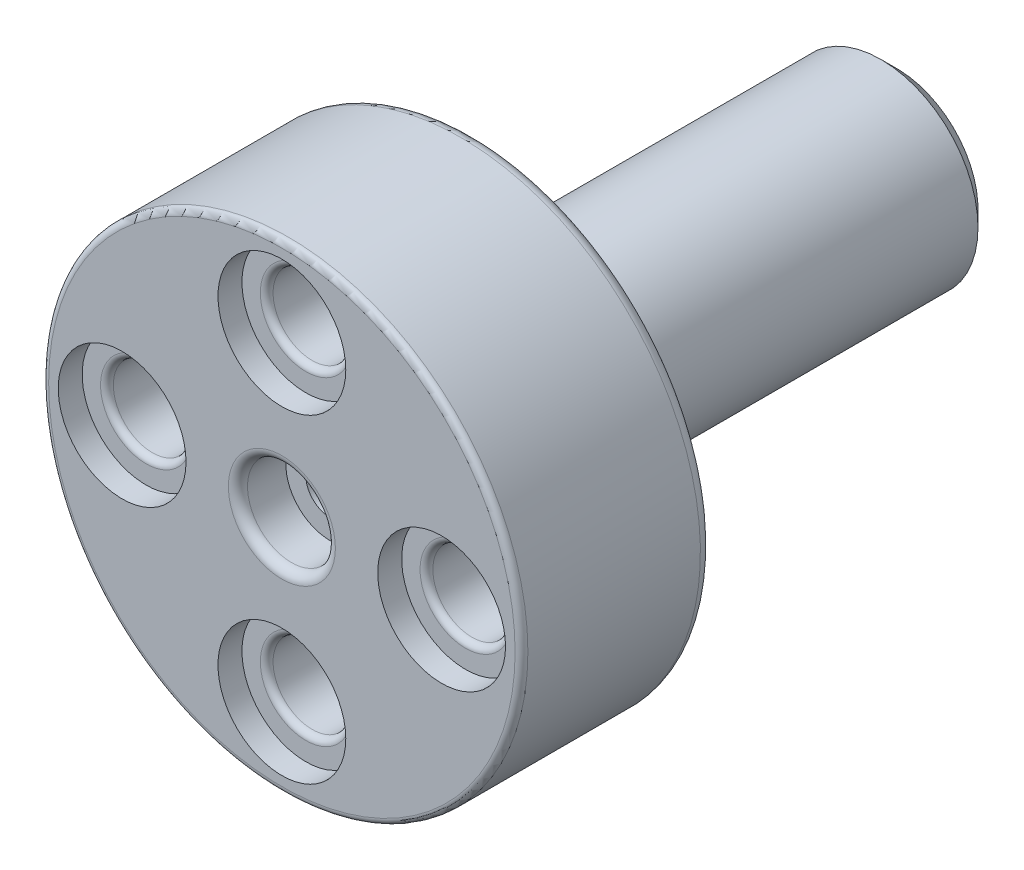
ISO-10303-21;
HEADER;
FILE_DESCRIPTION(('STEP AP214'),'2;1');
FILE_NAME('part.step','',(''),(''),'','','');
FILE_SCHEMA(('AUTOMOTIVE_DESIGN { 1 0 10303 214 1 1 1 1 }'));
ENDSEC;
DATA;
#1=APPLICATION_CONTEXT('core data for automotive mechanical design processes');
#2=APPLICATION_PROTOCOL_DEFINITION('international standard','automotive_design',2000,#1);
#3=PRODUCT_CONTEXT('',#1,'mechanical');
#4=PRODUCT('Part','Part','',(#3));
#5=PRODUCT_RELATED_PRODUCT_CATEGORY('part','',(#4));
#6=PRODUCT_DEFINITION_FORMATION('','',#4);
#7=PRODUCT_DEFINITION_CONTEXT('part definition',#1,'design');
#8=PRODUCT_DEFINITION('design','',#6,#7);
#9=PRODUCT_DEFINITION_SHAPE('','',#8);
#10=(LENGTH_UNIT() NAMED_UNIT(*) SI_UNIT(.MILLI.,.METRE.));
#11=(NAMED_UNIT(*) PLANE_ANGLE_UNIT() SI_UNIT($,.RADIAN.));
#12=(NAMED_UNIT(*) SI_UNIT($,.STERADIAN.) SOLID_ANGLE_UNIT());
#13=UNCERTAINTY_MEASURE_WITH_UNIT(LENGTH_MEASURE(1.E-05),#10,'distance_accuracy_value','');
#14=(GEOMETRIC_REPRESENTATION_CONTEXT(3) GLOBAL_UNCERTAINTY_ASSIGNED_CONTEXT((#13)) GLOBAL_UNIT_ASSIGNED_CONTEXT((#10,
#11,#12)) REPRESENTATION_CONTEXT('',''));
#15=CARTESIAN_POINT('',(0.,0.,0.));
#16=DIRECTION('',(0.,0.,1.));
#17=DIRECTION('',(1.,0.,0.));
#18=AXIS2_PLACEMENT_3D('',#15,#16,#17);
#19=CARTESIAN_POINT('',(0.,0.,-17.3));
#20=DIRECTION('',(0.,0.,1.));
#21=DIRECTION('',(1.,0.,0.));
#22=AXIS2_PLACEMENT_3D('',#19,#20,#21);
#23=CYLINDRICAL_SURFACE('',#22,1.5);
#24=CARTESIAN_POINT('',(0.,0.,-17.3));
#25=DIRECTION('',(0.,0.,1.));
#26=DIRECTION('',(1.,0.,0.));
#27=AXIS2_PLACEMENT_3D('',#24,#25,#26);
#28=CIRCLE('',#27,1.5);
#29=CARTESIAN_POINT('',(1.5,0.,-17.3));
#30=VERTEX_POINT('',#29);
#31=EDGE_CURVE('E324',#30,#30,#28,.T.);
#32=ORIENTED_EDGE('',*,*,#31,.F.);
#33=EDGE_LOOP('',(#32));
#34=FACE_BOUND('',#33,.T.);
#35=CARTESIAN_POINT('',(0.,0.,18.2));
#36=DIRECTION('',(0.,0.,1.));
#37=DIRECTION('',(1.,0.,0.));
#38=AXIS2_PLACEMENT_3D('',#35,#36,#37);
#39=CIRCLE('',#38,1.5);
#40=CARTESIAN_POINT('',(1.5,0.,18.2));
#41=VERTEX_POINT('',#40);
#42=EDGE_CURVE('E321',#41,#41,#39,.F.);
#43=ORIENTED_EDGE('',*,*,#42,.F.);
#44=EDGE_LOOP('',(#43));
#45=FACE_BOUND('',#44,.T.);
#46=ADVANCED_FACE('F37',(#34,#45),#23,.F.);
#47=CARTESIAN_POINT('',(10.,0.,-16.5000000539506));
#48=DIRECTION('',(0.,0.,1.));
#49=DIRECTION('',(1.,0.,0.));
#50=AXIS2_PLACEMENT_3D('',#47,#48,#49);
#51=CYLINDRICAL_SURFACE('',#50,2.45);
#52=CARTESIAN_POINT('',(10.,0.,11.3));
#53=DIRECTION('',(0.,0.,1.));
#54=DIRECTION('',(1.,0.,0.));
#55=AXIS2_PLACEMENT_3D('',#52,#53,#54);
#56=CIRCLE('',#55,2.45);
#57=CARTESIAN_POINT('',(12.45,0.,11.3));
#58=VERTEX_POINT('',#57);
#59=EDGE_CURVE('E412',#58,#58,#56,.T.);
#60=ORIENTED_EDGE('',*,*,#59,.F.);
#61=EDGE_LOOP('',(#60));
#62=FACE_BOUND('',#61,.T.);
#63=CARTESIAN_POINT('',(10.,0.,19.3));
#64=DIRECTION('',(0.,0.,1.));
#65=DIRECTION('',(1.,0.,0.));
#66=AXIS2_PLACEMENT_3D('',#63,#64,#65);
#67=CIRCLE('',#66,2.45);
#68=CARTESIAN_POINT('',(12.45,0.,19.3));
#69=VERTEX_POINT('',#68);
#70=EDGE_CURVE('E339',#69,#69,#67,.T.);
#71=ORIENTED_EDGE('',*,*,#70,.T.);
#72=EDGE_LOOP('',(#71));
#73=FACE_BOUND('',#72,.T.);
#74=ADVANCED_FACE('F160',(#62,#73),#51,.F.);
#75=CARTESIAN_POINT('',(0.,-10.,-16.5000000539506));
#76=DIRECTION('',(0.,0.,1.));
#77=DIRECTION('',(1.,0.,0.));
#78=AXIS2_PLACEMENT_3D('',#75,#76,#77);
#79=CYLINDRICAL_SURFACE('',#78,2.45);
#80=CARTESIAN_POINT('',(0.,-10.,11.3));
#81=DIRECTION('',(0.,0.,1.));
#82=DIRECTION('',(1.,0.,0.));
#83=AXIS2_PLACEMENT_3D('',#80,#81,#82);
#84=CIRCLE('',#83,2.45);
#85=CARTESIAN_POINT('',(2.45,-10.,11.3));
#86=VERTEX_POINT('',#85);
#87=EDGE_CURVE('E394',#86,#86,#84,.T.);
#88=ORIENTED_EDGE('',*,*,#87,.F.);
#89=EDGE_LOOP('',(#88));
#90=FACE_BOUND('',#89,.T.);
#91=CARTESIAN_POINT('',(0.,-10.,19.3));
#92=DIRECTION('',(0.,0.,1.));
#93=DIRECTION('',(1.,0.,0.));
#94=AXIS2_PLACEMENT_3D('',#91,#92,#93);
#95=CIRCLE('',#94,2.45);
#96=CARTESIAN_POINT('',(2.45,-10.,19.3));
#97=VERTEX_POINT('',#96);
#98=EDGE_CURVE('E333',#97,#97,#95,.T.);
#99=ORIENTED_EDGE('',*,*,#98,.T.);
#100=EDGE_LOOP('',(#99));
#101=FACE_BOUND('',#100,.T.);
#102=ADVANCED_FACE('F166',(#90,#101),#79,.F.);
#103=CARTESIAN_POINT('',(-10.,0.,-16.5000000539506));
#104=DIRECTION('',(0.,0.,1.));
#105=DIRECTION('',(1.,0.,0.));
#106=AXIS2_PLACEMENT_3D('',#103,#104,#105);
#107=CYLINDRICAL_SURFACE('',#106,2.45);
#108=CARTESIAN_POINT('',(-10.,0.,11.3));
#109=DIRECTION('',(0.,0.,1.));
#110=DIRECTION('',(1.,0.,0.));
#111=AXIS2_PLACEMENT_3D('',#108,#109,#110);
#112=CIRCLE('',#111,2.45);
#113=CARTESIAN_POINT('',(-7.55,0.,11.3));
#114=VERTEX_POINT('',#113);
#115=EDGE_CURVE('E385',#114,#114,#112,.T.);
#116=ORIENTED_EDGE('',*,*,#115,.F.);
#117=EDGE_LOOP('',(#116));
#118=FACE_BOUND('',#117,.T.);
#119=CARTESIAN_POINT('',(-10.,0.,19.3));
#120=DIRECTION('',(0.,0.,1.));
#121=DIRECTION('',(1.,0.,0.));
#122=AXIS2_PLACEMENT_3D('',#119,#120,#121);
#123=CIRCLE('',#122,2.45);
#124=CARTESIAN_POINT('',(-7.55,0.,19.3));
#125=VERTEX_POINT('',#124);
#126=EDGE_CURVE('E327',#125,#125,#123,.T.);
#127=ORIENTED_EDGE('',*,*,#126,.T.);
#128=EDGE_LOOP('',(#127));
#129=FACE_BOUND('',#128,.T.);
#130=ADVANCED_FACE('F253',(#118,#129),#107,.F.);
#131=CARTESIAN_POINT('',(0.,10.,-16.5000000539506));
#132=DIRECTION('',(0.,0.,1.));
#133=DIRECTION('',(1.,0.,0.));
#134=AXIS2_PLACEMENT_3D('',#131,#132,#133);
#135=CYLINDRICAL_SURFACE('',#134,2.45);
#136=CARTESIAN_POINT('',(0.,10.,11.3));
#137=DIRECTION('',(0.,0.,1.));
#138=DIRECTION('',(1.,0.,0.));
#139=AXIS2_PLACEMENT_3D('',#136,#137,#138);
#140=CIRCLE('',#139,2.45);
#141=CARTESIAN_POINT('',(2.45,10.,11.3));
#142=VERTEX_POINT('',#141);
#143=EDGE_CURVE('E403',#142,#142,#140,.T.);
#144=ORIENTED_EDGE('',*,*,#143,.F.);
#145=EDGE_LOOP('',(#144));
#146=FACE_BOUND('',#145,.T.);
#147=CARTESIAN_POINT('',(0.,10.,19.3));
#148=DIRECTION('',(0.,0.,1.));
#149=DIRECTION('',(1.,0.,0.));
#150=AXIS2_PLACEMENT_3D('',#147,#148,#149);
#151=CIRCLE('',#150,2.45);
#152=CARTESIAN_POINT('',(2.45,10.,19.3));
#153=VERTEX_POINT('',#152);
#154=EDGE_CURVE('E345',#153,#153,#151,.T.);
#155=ORIENTED_EDGE('',*,*,#154,.T.);
#156=EDGE_LOOP('',(#155));
#157=FACE_BOUND('',#156,.T.);
#158=ADVANCED_FACE('F249',(#146,#157),#135,.F.);
#159=CARTESIAN_POINT('',(0.,0.,9.2));
#160=DIRECTION('',(0.,0.,1.));
#161=DIRECTION('',(1.,0.,0.));
#162=AXIS2_PLACEMENT_3D('',#159,#160,#161);
#163=PLANE('',#162);
#164=CARTESIAN_POINT('',(0.,0.,9.2));
#165=DIRECTION('',(0.,0.,1.));
#166=DIRECTION('',(1.,0.,0.));
#167=AXIS2_PLACEMENT_3D('',#164,#165,#166);
#168=CIRCLE('',#167,14.2);
#169=CARTESIAN_POINT('',(-8.14478529140609,11.6319591022706,9.2));
#170=VERTEX_POINT('',#169);
#171=CARTESIAN_POINT('',(11.6319589555369,-8.14478550096353,9.2));
#172=VERTEX_POINT('',#171);
#173=EDGE_CURVE('E113',#170,#172,#168,.F.);
#174=ORIENTED_EDGE('',*,*,#173,.T.);
#175=CARTESIAN_POINT('',(0.,0.,9.2));
#176=DIRECTION('',(0.,0.,1.));
#177=DIRECTION('',(1.,0.,0.));
#178=AXIS2_PLACEMENT_3D('',#175,#176,#177);
#179=CIRCLE('',#178,14.2);
#180=CARTESIAN_POINT('',(8.14478529140617,-11.6319591022705,9.2));
#181=VERTEX_POINT('',#180);
#182=EDGE_CURVE('E95',#172,#181,#179,.F.);
#183=ORIENTED_EDGE('',*,*,#182,.T.);
#184=CARTESIAN_POINT('',(0.,0.,9.2));
#185=DIRECTION('',(0.,0.,1.));
#186=DIRECTION('',(1.,0.,0.));
#187=AXIS2_PLACEMENT_3D('',#184,#185,#186);
#188=CIRCLE('',#187,14.2);
#189=CARTESIAN_POINT('',(-8.14478550096365,-11.6319589555368,9.2));
#190=VERTEX_POINT('',#189);
#191=EDGE_CURVE('E59',#181,#190,#188,.F.);
#192=ORIENTED_EDGE('',*,*,#191,.T.);
#193=CARTESIAN_POINT('',(0.,0.,9.2));
#194=DIRECTION('',(0.,0.,1.));
#195=DIRECTION('',(1.,0.,0.));
#196=AXIS2_PLACEMENT_3D('',#193,#194,#195);
#197=CIRCLE('',#196,14.2);
#198=CARTESIAN_POINT('',(-11.6319591022706,-8.14478529140605,9.2));
#199=VERTEX_POINT('',#198);
#200=EDGE_CURVE('E124',#190,#199,#197,.F.);
#201=ORIENTED_EDGE('',*,*,#200,.T.);
#202=CARTESIAN_POINT('',(0.,0.,9.2));
#203=DIRECTION('',(0.,0.,1.));
#204=DIRECTION('',(1.,0.,0.));
#205=AXIS2_PLACEMENT_3D('',#202,#203,#204);
#206=CIRCLE('',#205,14.2);
#207=CARTESIAN_POINT('',(-11.6319589555368,8.14478550096361,9.2));
#208=VERTEX_POINT('',#207);
#209=EDGE_CURVE('E122',#199,#208,#206,.F.);
#210=ORIENTED_EDGE('',*,*,#209,.T.);
#211=CARTESIAN_POINT('',(0.,0.,9.2));
#212=DIRECTION('',(0.,0.,1.));
#213=DIRECTION('',(1.,0.,0.));
#214=AXIS2_PLACEMENT_3D('',#211,#212,#213);
#215=CIRCLE('',#214,14.2);
#216=EDGE_CURVE('E115',#208,#170,#215,.F.);
#217=ORIENTED_EDGE('',*,*,#216,.T.);
#218=EDGE_LOOP('',(#174,#183,#192,#201,#210,#217));
#219=FACE_BOUND('',#218,.T.);
#220=CARTESIAN_POINT('',(0.,0.,9.2));
#221=DIRECTION('',(0.,0.,1.));
#222=DIRECTION('',(1.,0.,0.));
#223=AXIS2_PLACEMENT_3D('',#220,#221,#222);
#224=CIRCLE('',#223,6.075);
#225=CARTESIAN_POINT('',(6.075,0.,9.2));
#226=VERTEX_POINT('',#225);
#227=EDGE_CURVE('E107',#226,#226,#224,.F.);
#228=ORIENTED_EDGE('',*,*,#227,.F.);
#229=EDGE_LOOP('',(#228));
#230=FACE_BOUND('',#229,.T.);
#231=CARTESIAN_POINT('',(10.,0.,9.2));
#232=DIRECTION('',(0.,0.,-1.));
#233=DIRECTION('',(-1.,0.,0.));
#234=AXIS2_PLACEMENT_3D('',#231,#232,#233);
#235=CIRCLE('',#234,3.);
#236=CARTESIAN_POINT('',(7.,0.,9.2));
#237=VERTEX_POINT('',#236);
#238=EDGE_CURVE('E375',#237,#237,#235,.T.);
#239=ORIENTED_EDGE('',*,*,#238,.F.);
#240=EDGE_LOOP('',(#239));
#241=FACE_BOUND('',#240,.T.);
#242=CARTESIAN_POINT('',(0.,10.,9.2));
#243=DIRECTION('',(0.,0.,-1.));
#244=DIRECTION('',(-1.,0.,0.));
#245=AXIS2_PLACEMENT_3D('',#242,#243,#244);
#246=CIRCLE('',#245,3.);
#247=CARTESIAN_POINT('',(-3.,10.,9.2));
#248=VERTEX_POINT('',#247);
#249=EDGE_CURVE('E404',#248,#248,#246,.T.);
#250=ORIENTED_EDGE('',*,*,#249,.F.);
#251=EDGE_LOOP('',(#250));
#252=FACE_BOUND('',#251,.T.);
#253=CARTESIAN_POINT('',(0.,-10.,9.2));
#254=DIRECTION('',(0.,0.,-1.));
#255=DIRECTION('',(-1.,0.,0.));
#256=AXIS2_PLACEMENT_3D('',#253,#254,#255);
#257=CIRCLE('',#256,3.);
#258=CARTESIAN_POINT('',(-3.,-10.,9.2));
#259=VERTEX_POINT('',#258);
#260=EDGE_CURVE('E395',#259,#259,#257,.T.);
#261=ORIENTED_EDGE('',*,*,#260,.F.);
#262=EDGE_LOOP('',(#261));
#263=FACE_BOUND('',#262,.T.);
#264=CARTESIAN_POINT('',(-10.,0.,9.2));
#265=DIRECTION('',(0.,0.,-1.));
#266=DIRECTION('',(-1.,0.,0.));
#267=AXIS2_PLACEMENT_3D('',#264,#265,#266);
#268=CIRCLE('',#267,3.);
#269=CARTESIAN_POINT('',(-13.,0.,9.2));
#270=VERTEX_POINT('',#269);
#271=EDGE_CURVE('E386',#270,#270,#268,.T.);
#272=ORIENTED_EDGE('',*,*,#271,.F.);
#273=EDGE_LOOP('',(#272));
#274=FACE_BOUND('',#273,.T.);
#275=ADVANCED_FACE('F252',(#219,#230,#241,#252,#263,#274),#163,.F.);
#276=CARTESIAN_POINT('',(0.,0.,21.2));
#277=DIRECTION('',(0.,0.,-1.));
#278=DIRECTION('',(-1.,0.,0.));
#279=AXIS2_PLACEMENT_3D('',#276,#277,#278);
#280=CYLINDRICAL_SURFACE('',#279,15.);
#281=CARTESIAN_POINT('',(0.,0.,10.));
#282=DIRECTION('',(0.,0.,1.));
#283=DIRECTION('',(1.,0.,0.));
#284=AXIS2_PLACEMENT_3D('',#281,#282,#283);
#285=CIRCLE('',#284,15.);
#286=CARTESIAN_POINT('',(-8.60364665594751,-12.2872805868346,10.));
#287=VERTEX_POINT('',#286);
#288=CARTESIAN_POINT('',(8.60364643458398,-12.287280741835,10.));
#289=VERTEX_POINT('',#288);
#290=EDGE_CURVE('E112',#287,#289,#285,.T.);
#291=ORIENTED_EDGE('',*,*,#290,.T.);
#292=CARTESIAN_POINT('',(0.,0.,10.));
#293=DIRECTION('',(0.,0.,1.));
#294=DIRECTION('',(1.,0.,0.));
#295=AXIS2_PLACEMENT_3D('',#292,#293,#294);
#296=CIRCLE('',#295,15.);
#297=CARTESIAN_POINT('',(12.2872805868347,-8.60364665594739,10.));
#298=VERTEX_POINT('',#297);
#299=EDGE_CURVE('E94',#289,#298,#296,.T.);
#300=ORIENTED_EDGE('',*,*,#299,.T.);
#301=CARTESIAN_POINT('',(0.,0.,10.));
#302=DIRECTION('',(0.,0.,1.));
#303=DIRECTION('',(1.,0.,0.));
#304=AXIS2_PLACEMENT_3D('',#301,#302,#303);
#305=CIRCLE('',#304,15.);
#306=CARTESIAN_POINT('',(-8.6036464345839,12.2872807418351,10.));
#307=VERTEX_POINT('',#306);
#308=EDGE_CURVE('E100',#298,#307,#305,.T.);
#309=ORIENTED_EDGE('',*,*,#308,.T.);
#310=CARTESIAN_POINT('',(0.,0.,10.));
#311=DIRECTION('',(0.,0.,1.));
#312=DIRECTION('',(1.,0.,0.));
#313=AXIS2_PLACEMENT_3D('',#310,#311,#312);
#314=CIRCLE('',#313,15.);
#315=CARTESIAN_POINT('',(-12.2872805868347,8.60364665594747,10.));
#316=VERTEX_POINT('',#315);
#317=EDGE_CURVE('E106',#307,#316,#314,.T.);
#318=ORIENTED_EDGE('',*,*,#317,.T.);
#319=CARTESIAN_POINT('',(0.,0.,10.));
#320=DIRECTION('',(0.,0.,1.));
#321=DIRECTION('',(1.,0.,0.));
#322=AXIS2_PLACEMENT_3D('',#319,#320,#321);
#323=CIRCLE('',#322,15.);
#324=CARTESIAN_POINT('',(-12.2872807418351,-8.60364643458386,10.));
#325=VERTEX_POINT('',#324);
#326=EDGE_CURVE('E314',#316,#325,#323,.T.);
#327=ORIENTED_EDGE('',*,*,#326,.T.);
#328=CARTESIAN_POINT('',(0.,0.,10.));
#329=DIRECTION('',(0.,0.,1.));
#330=DIRECTION('',(1.,0.,0.));
#331=AXIS2_PLACEMENT_3D('',#328,#329,#330);
#332=CIRCLE('',#331,15.);
#333=EDGE_CURVE('E117',#325,#287,#332,.T.);
#334=ORIENTED_EDGE('',*,*,#333,.T.);
#335=EDGE_LOOP('',(#291,#300,#309,#318,#327,#334));
#336=FACE_BOUND('',#335,.T.);
#337=CARTESIAN_POINT('',(0.,0.,20.8));
#338=DIRECTION('',(0.,0.,1.));
#339=DIRECTION('',(1.,0.,0.));
#340=AXIS2_PLACEMENT_3D('',#337,#338,#339);
#341=CIRCLE('',#340,15.);
#342=CARTESIAN_POINT('',(15.,0.,20.8));
#343=VERTEX_POINT('',#342);
#344=EDGE_CURVE('E351',#343,#343,#341,.F.);
#345=ORIENTED_EDGE('',*,*,#344,.T.);
#346=EDGE_LOOP('',(#345));
#347=FACE_BOUND('',#346,.T.);
#348=ADVANCED_FACE('F109',(#336,#347),#280,.T.);
#349=CARTESIAN_POINT('',(0.,0.,21.2));
#350=DIRECTION('',(0.,0.,1.));
#351=DIRECTION('',(1.,0.,0.));
#352=AXIS2_PLACEMENT_3D('',#349,#350,#351);
#353=PLANE('',#352);
#354=CARTESIAN_POINT('',(0.,0.,21.2));
#355=DIRECTION('',(0.,0.,1.));
#356=DIRECTION('',(1.,0.,0.));
#357=AXIS2_PLACEMENT_3D('',#354,#355,#356);
#358=CIRCLE('',#357,3.35);
#359=CARTESIAN_POINT('',(3.35,0.,21.2));
#360=VERTEX_POINT('',#359);
#361=EDGE_CURVE('E143',#360,#360,#358,.F.);
#362=ORIENTED_EDGE('',*,*,#361,.T.);
#363=EDGE_LOOP('',(#362));
#364=FACE_BOUND('',#363,.T.);
#365=CARTESIAN_POINT('',(0.,0.,21.2));
#366=DIRECTION('',(0.,0.,1.));
#367=DIRECTION('',(1.,0.,0.));
#368=AXIS2_PLACEMENT_3D('',#365,#366,#367);
#369=CIRCLE('',#368,14.6);
#370=CARTESIAN_POINT('',(14.6,0.,21.2));
#371=VERTEX_POINT('',#370);
#372=EDGE_CURVE('E354',#371,#371,#369,.T.);
#373=ORIENTED_EDGE('',*,*,#372,.T.);
#374=EDGE_LOOP('',(#373));
#375=FACE_BOUND('',#374,.T.);
#376=CARTESIAN_POINT('',(-10.,0.,21.2));
#377=DIRECTION('',(0.,0.,1.));
#378=DIRECTION('',(1.,0.,0.));
#379=AXIS2_PLACEMENT_3D('',#376,#377,#378);
#380=CIRCLE('',#379,4.);
#381=CARTESIAN_POINT('',(-6.,0.,21.2));
#382=VERTEX_POINT('',#381);
#383=EDGE_CURVE('E371',#382,#382,#380,.T.);
#384=ORIENTED_EDGE('',*,*,#383,.F.);
#385=EDGE_LOOP('',(#384));
#386=FACE_BOUND('',#385,.T.);
#387=CARTESIAN_POINT('',(0.,-10.,21.2));
#388=DIRECTION('',(0.,0.,1.));
#389=DIRECTION('',(1.,0.,0.));
#390=AXIS2_PLACEMENT_3D('',#387,#388,#389);
#391=CIRCLE('',#390,4.);
#392=CARTESIAN_POINT('',(4.,-10.,21.2));
#393=VERTEX_POINT('',#392);
#394=EDGE_CURVE('E372',#393,#393,#391,.T.);
#395=ORIENTED_EDGE('',*,*,#394,.F.);
#396=EDGE_LOOP('',(#395));
#397=FACE_BOUND('',#396,.T.);
#398=CARTESIAN_POINT('',(10.,0.,21.2));
#399=DIRECTION('',(0.,0.,1.));
#400=DIRECTION('',(1.,0.,0.));
#401=AXIS2_PLACEMENT_3D('',#398,#399,#400);
#402=CIRCLE('',#401,4.);
#403=CARTESIAN_POINT('',(14.,0.,21.2));
#404=VERTEX_POINT('',#403);
#405=EDGE_CURVE('E358',#404,#404,#402,.T.);
#406=ORIENTED_EDGE('',*,*,#405,.F.);
#407=EDGE_LOOP('',(#406));
#408=FACE_BOUND('',#407,.T.);
#409=CARTESIAN_POINT('',(0.,10.,21.2));
#410=DIRECTION('',(0.,0.,1.));
#411=DIRECTION('',(1.,0.,0.));
#412=AXIS2_PLACEMENT_3D('',#409,#410,#411);
#413=CIRCLE('',#412,4.);
#414=CARTESIAN_POINT('',(4.,10.,21.2));
#415=VERTEX_POINT('',#414);
#416=EDGE_CURVE('E365',#415,#415,#413,.T.);
#417=ORIENTED_EDGE('',*,*,#416,.F.);
#418=EDGE_LOOP('',(#417));
#419=FACE_BOUND('',#418,.T.);
#420=ADVANCED_FACE('F236',(#364,#375,#386,#397,#408,#419),#353,.T.);
#421=CARTESIAN_POINT('',(0.,10.,19.7));
#422=DIRECTION('',(0.,0.,1.));
#423=DIRECTION('',(1.,0.,0.));
#424=AXIS2_PLACEMENT_3D('',#421,#422,#423);
#425=PLANE('',#424);
#426=CARTESIAN_POINT('',(0.,10.,19.7));
#427=DIRECTION('',(0.,0.,1.));
#428=DIRECTION('',(1.,0.,0.));
#429=AXIS2_PLACEMENT_3D('',#426,#427,#428);
#430=CIRCLE('',#429,2.85);
#431=CARTESIAN_POINT('',(2.85,10.,19.7));
#432=VERTEX_POINT('',#431);
#433=EDGE_CURVE('E348',#432,#432,#430,.F.);
#434=ORIENTED_EDGE('',*,*,#433,.T.);
#435=EDGE_LOOP('',(#434));
#436=FACE_BOUND('',#435,.T.);
#437=CARTESIAN_POINT('',(0.,10.,19.7));
#438=DIRECTION('',(0.,0.,1.));
#439=DIRECTION('',(1.,0.,0.));
#440=AXIS2_PLACEMENT_3D('',#437,#438,#439);
#441=CIRCLE('',#440,4.);
#442=CARTESIAN_POINT('',(4.,10.,19.7));
#443=VERTEX_POINT('',#442);
#444=EDGE_CURVE('E368',#443,#443,#441,.T.);
#445=ORIENTED_EDGE('',*,*,#444,.T.);
#446=EDGE_LOOP('',(#445));
#447=FACE_BOUND('',#446,.T.);
#448=ADVANCED_FACE('F233',(#436,#447),#425,.T.);
#449=CARTESIAN_POINT('',(0.,10.,19.7));
#450=DIRECTION('',(0.,0.,1.));
#451=DIRECTION('',(1.,0.,0.));
#452=AXIS2_PLACEMENT_3D('',#449,#450,#451);
#453=CYLINDRICAL_SURFACE('',#452,4.);
#454=ORIENTED_EDGE('',*,*,#444,.F.);
#455=EDGE_LOOP('',(#454));
#456=FACE_BOUND('',#455,.T.);
#457=ORIENTED_EDGE('',*,*,#416,.T.);
#458=EDGE_LOOP('',(#457));
#459=FACE_BOUND('',#458,.T.);
#460=ADVANCED_FACE('F219',(#456,#459),#453,.F.);
#461=CARTESIAN_POINT('',(-10.,0.,19.7));
#462=DIRECTION('',(0.,0.,1.));
#463=DIRECTION('',(1.,0.,0.));
#464=AXIS2_PLACEMENT_3D('',#461,#462,#463);
#465=PLANE('',#464);
#466=CARTESIAN_POINT('',(-10.,0.,19.7));
#467=DIRECTION('',(0.,0.,1.));
#468=DIRECTION('',(1.,0.,0.));
#469=AXIS2_PLACEMENT_3D('',#466,#467,#468);
#470=CIRCLE('',#469,2.85);
#471=CARTESIAN_POINT('',(-7.15,0.,19.7));
#472=VERTEX_POINT('',#471);
#473=EDGE_CURVE('E330',#472,#472,#470,.F.);
#474=ORIENTED_EDGE('',*,*,#473,.T.);
#475=EDGE_LOOP('',(#474));
#476=FACE_BOUND('',#475,.T.);
#477=CARTESIAN_POINT('',(-10.,0.,19.7));
#478=DIRECTION('',(0.,0.,1.));
#479=DIRECTION('',(1.,0.,0.));
#480=AXIS2_PLACEMENT_3D('',#477,#478,#479);
#481=CIRCLE('',#480,4.);
#482=CARTESIAN_POINT('',(-6.,0.,19.7));
#483=VERTEX_POINT('',#482);
#484=EDGE_CURVE('E357',#483,#483,#481,.T.);
#485=ORIENTED_EDGE('',*,*,#484,.T.);
#486=EDGE_LOOP('',(#485));
#487=FACE_BOUND('',#486,.T.);
#488=ADVANCED_FACE('F215',(#476,#487),#465,.T.);
#489=CARTESIAN_POINT('',(-10.,0.,19.7));
#490=DIRECTION('',(0.,0.,1.));
#491=DIRECTION('',(1.,0.,0.));
#492=AXIS2_PLACEMENT_3D('',#489,#490,#491);
#493=CYLINDRICAL_SURFACE('',#492,4.);
#494=ORIENTED_EDGE('',*,*,#484,.F.);
#495=EDGE_LOOP('',(#494));
#496=FACE_BOUND('',#495,.T.);
#497=ORIENTED_EDGE('',*,*,#383,.T.);
#498=EDGE_LOOP('',(#497));
#499=FACE_BOUND('',#498,.T.);
#500=ADVANCED_FACE('F218',(#496,#499),#493,.F.);
#501=CARTESIAN_POINT('',(0.,-10.,19.7));
#502=DIRECTION('',(0.,0.,1.));
#503=DIRECTION('',(1.,0.,0.));
#504=AXIS2_PLACEMENT_3D('',#501,#502,#503);
#505=PLANE('',#504);
#506=CARTESIAN_POINT('',(0.,-10.,19.7));
#507=DIRECTION('',(0.,0.,1.));
#508=DIRECTION('',(1.,0.,0.));
#509=AXIS2_PLACEMENT_3D('',#506,#507,#508);
#510=CIRCLE('',#509,2.85);
#511=CARTESIAN_POINT('',(2.85,-10.,19.7));
#512=VERTEX_POINT('',#511);
#513=EDGE_CURVE('E336',#512,#512,#510,.F.);
#514=ORIENTED_EDGE('',*,*,#513,.T.);
#515=EDGE_LOOP('',(#514));
#516=FACE_BOUND('',#515,.T.);
#517=CARTESIAN_POINT('',(0.,-10.,19.7));
#518=DIRECTION('',(0.,0.,1.));
#519=DIRECTION('',(1.,0.,0.));
#520=AXIS2_PLACEMENT_3D('',#517,#518,#519);
#521=CIRCLE('',#520,4.);
#522=CARTESIAN_POINT('',(4.,-10.,19.7));
#523=VERTEX_POINT('',#522);
#524=EDGE_CURVE('E362',#523,#523,#521,.T.);
#525=ORIENTED_EDGE('',*,*,#524,.T.);
#526=EDGE_LOOP('',(#525));
#527=FACE_BOUND('',#526,.T.);
#528=ADVANCED_FACE('F223',(#516,#527),#505,.T.);
#529=CARTESIAN_POINT('',(0.,-10.,19.7));
#530=DIRECTION('',(0.,0.,1.));
#531=DIRECTION('',(1.,0.,0.));
#532=AXIS2_PLACEMENT_3D('',#529,#530,#531);
#533=CYLINDRICAL_SURFACE('',#532,4.);
#534=ORIENTED_EDGE('',*,*,#524,.F.);
#535=EDGE_LOOP('',(#534));
#536=FACE_BOUND('',#535,.T.);
#537=ORIENTED_EDGE('',*,*,#394,.T.);
#538=EDGE_LOOP('',(#537));
#539=FACE_BOUND('',#538,.T.);
#540=ADVANCED_FACE('F227',(#536,#539),#533,.F.);
#541=CARTESIAN_POINT('',(10.,0.,19.7));
#542=DIRECTION('',(0.,0.,1.));
#543=DIRECTION('',(1.,0.,0.));
#544=AXIS2_PLACEMENT_3D('',#541,#542,#543);
#545=PLANE('',#544);
#546=CARTESIAN_POINT('',(10.,0.,19.7));
#547=DIRECTION('',(0.,0.,1.));
#548=DIRECTION('',(1.,0.,0.));
#549=AXIS2_PLACEMENT_3D('',#546,#547,#548);
#550=CIRCLE('',#549,2.85);
#551=CARTESIAN_POINT('',(12.85,0.,19.7));
#552=VERTEX_POINT('',#551);
#553=EDGE_CURVE('E342',#552,#552,#550,.F.);
#554=ORIENTED_EDGE('',*,*,#553,.T.);
#555=EDGE_LOOP('',(#554));
#556=FACE_BOUND('',#555,.T.);
#557=CARTESIAN_POINT('',(10.,0.,19.7));
#558=DIRECTION('',(0.,0.,1.));
#559=DIRECTION('',(1.,0.,0.));
#560=AXIS2_PLACEMENT_3D('',#557,#558,#559);
#561=CIRCLE('',#560,4.);
#562=CARTESIAN_POINT('',(14.,0.,19.7));
#563=VERTEX_POINT('',#562);
#564=EDGE_CURVE('E361',#563,#563,#561,.T.);
#565=ORIENTED_EDGE('',*,*,#564,.T.);
#566=EDGE_LOOP('',(#565));
#567=FACE_BOUND('',#566,.T.);
#568=ADVANCED_FACE('F231',(#556,#567),#545,.T.);
#569=CARTESIAN_POINT('',(10.,0.,19.7));
#570=DIRECTION('',(0.,0.,1.));
#571=DIRECTION('',(1.,0.,0.));
#572=AXIS2_PLACEMENT_3D('',#569,#570,#571);
#573=CYLINDRICAL_SURFACE('',#572,4.);
#574=ORIENTED_EDGE('',*,*,#564,.F.);
#575=EDGE_LOOP('',(#574));
#576=FACE_BOUND('',#575,.T.);
#577=ORIENTED_EDGE('',*,*,#405,.T.);
#578=EDGE_LOOP('',(#577));
#579=FACE_BOUND('',#578,.T.);
#580=ADVANCED_FACE('F243',(#576,#579),#573,.F.);
#581=CARTESIAN_POINT('',(0.,0.,20.8));
#582=DIRECTION('',(0.,0.,1.));
#583=DIRECTION('',(1.,0.,0.));
#584=AXIS2_PLACEMENT_3D('',#581,#582,#583);
#585=TOROIDAL_SURFACE('',#584,14.6,0.4);
#586=ORIENTED_EDGE('',*,*,#344,.F.);
#587=EDGE_LOOP('',(#586));
#588=FACE_BOUND('',#587,.T.);
#589=ORIENTED_EDGE('',*,*,#372,.F.);
#590=EDGE_LOOP('',(#589));
#591=FACE_BOUND('',#590,.T.);
#592=ADVANCED_FACE('F247',(#588,#591),#585,.T.);
#593=CARTESIAN_POINT('',(0.,10.,19.3));
#594=DIRECTION('',(0.,0.,1.));
#595=DIRECTION('',(1.,0.,0.));
#596=AXIS2_PLACEMENT_3D('',#593,#594,#595);
#597=TOROIDAL_SURFACE('',#596,2.85,0.4);
#598=ORIENTED_EDGE('',*,*,#154,.F.);
#599=EDGE_LOOP('',(#598));
#600=FACE_BOUND('',#599,.T.);
#601=ORIENTED_EDGE('',*,*,#433,.F.);
#602=EDGE_LOOP('',(#601));
#603=FACE_BOUND('',#602,.T.);
#604=ADVANCED_FACE('F270',(#600,#603),#597,.T.);
#605=CARTESIAN_POINT('',(10.,0.,19.3));
#606=DIRECTION('',(0.,0.,1.));
#607=DIRECTION('',(1.,0.,0.));
#608=AXIS2_PLACEMENT_3D('',#605,#606,#607);
#609=TOROIDAL_SURFACE('',#608,2.85,0.4);
#610=ORIENTED_EDGE('',*,*,#70,.F.);
#611=EDGE_LOOP('',(#610));
#612=FACE_BOUND('',#611,.T.);
#613=ORIENTED_EDGE('',*,*,#553,.F.);
#614=EDGE_LOOP('',(#613));
#615=FACE_BOUND('',#614,.T.);
#616=ADVANCED_FACE('F274',(#612,#615),#609,.T.);
#617=CARTESIAN_POINT('',(0.,-10.,19.3));
#618=DIRECTION('',(0.,0.,1.));
#619=DIRECTION('',(1.,0.,0.));
#620=AXIS2_PLACEMENT_3D('',#617,#618,#619);
#621=TOROIDAL_SURFACE('',#620,2.85,0.4);
#622=ORIENTED_EDGE('',*,*,#98,.F.);
#623=EDGE_LOOP('',(#622));
#624=FACE_BOUND('',#623,.T.);
#625=ORIENTED_EDGE('',*,*,#513,.F.);
#626=EDGE_LOOP('',(#625));
#627=FACE_BOUND('',#626,.T.);
#628=ADVANCED_FACE('F278',(#624,#627),#621,.T.);
#629=CARTESIAN_POINT('',(-10.,0.,19.3));
#630=DIRECTION('',(0.,0.,1.));
#631=DIRECTION('',(1.,0.,0.));
#632=AXIS2_PLACEMENT_3D('',#629,#630,#631);
#633=TOROIDAL_SURFACE('',#632,2.85,0.4);
#634=ORIENTED_EDGE('',*,*,#126,.F.);
#635=EDGE_LOOP('',(#634));
#636=FACE_BOUND('',#635,.T.);
#637=ORIENTED_EDGE('',*,*,#473,.F.);
#638=EDGE_LOOP('',(#637));
#639=FACE_BOUND('',#638,.T.);
#640=ADVANCED_FACE('F213',(#636,#639),#633,.T.);
#641=CARTESIAN_POINT('',(-10.,0.,28.1852813742386));
#642=DIRECTION('',(0.,0.,-1.));
#643=DIRECTION('',(-1.,0.,0.));
#644=AXIS2_PLACEMENT_3D('',#641,#642,#643);
#645=CYLINDRICAL_SURFACE('',#644,3.);
#646=ORIENTED_EDGE('',*,*,#271,.T.);
#647=EDGE_LOOP('',(#646));
#648=FACE_BOUND('',#647,.T.);
#649=CARTESIAN_POINT('',(-10.,0.,11.3));
#650=DIRECTION('',(0.,0.,1.));
#651=DIRECTION('',(1.,0.,0.));
#652=AXIS2_PLACEMENT_3D('',#649,#650,#651);
#653=CIRCLE('',#652,3.);
#654=CARTESIAN_POINT('',(-7.,0.,11.3));
#655=VERTEX_POINT('',#654);
#656=EDGE_CURVE('E382',#655,#655,#653,.F.);
#657=ORIENTED_EDGE('',*,*,#656,.F.);
#658=EDGE_LOOP('',(#657));
#659=FACE_BOUND('',#658,.T.);
#660=ADVANCED_FACE('F209',(#648,#659),#645,.F.);
#661=CARTESIAN_POINT('',(0.,10.,11.3));
#662=DIRECTION('',(0.,0.,1.));
#663=DIRECTION('',(1.,0.,0.));
#664=AXIS2_PLACEMENT_3D('',#661,#662,#663);
#665=PLANE('',#664);
#666=ORIENTED_EDGE('',*,*,#115,.T.);
#667=EDGE_LOOP('',(#666));
#668=FACE_BOUND('',#667,.T.);
#669=ORIENTED_EDGE('',*,*,#656,.T.);
#670=EDGE_LOOP('',(#669));
#671=FACE_BOUND('',#670,.T.);
#672=ADVANCED_FACE('F205',(#668,#671),#665,.F.);
#673=CARTESIAN_POINT('',(0.,-10.,28.1852813742386));
#674=DIRECTION('',(0.,0.,-1.));
#675=DIRECTION('',(-1.,0.,0.));
#676=AXIS2_PLACEMENT_3D('',#673,#674,#675);
#677=CYLINDRICAL_SURFACE('',#676,3.);
#678=ORIENTED_EDGE('',*,*,#260,.T.);
#679=EDGE_LOOP('',(#678));
#680=FACE_BOUND('',#679,.T.);
#681=CARTESIAN_POINT('',(0.,-10.,11.3));
#682=DIRECTION('',(0.,0.,1.));
#683=DIRECTION('',(1.,0.,0.));
#684=AXIS2_PLACEMENT_3D('',#681,#682,#683);
#685=CIRCLE('',#684,3.);
#686=CARTESIAN_POINT('',(3.,-10.,11.3));
#687=VERTEX_POINT('',#686);
#688=EDGE_CURVE('E389',#687,#687,#685,.F.);
#689=ORIENTED_EDGE('',*,*,#688,.F.);
#690=EDGE_LOOP('',(#689));
#691=FACE_BOUND('',#690,.T.);
#692=ADVANCED_FACE('F201',(#680,#691),#677,.F.);
#693=CARTESIAN_POINT('',(0.,10.,11.3));
#694=DIRECTION('',(0.,0.,1.));
#695=DIRECTION('',(1.,0.,0.));
#696=AXIS2_PLACEMENT_3D('',#693,#694,#695);
#697=PLANE('',#696);
#698=ORIENTED_EDGE('',*,*,#87,.T.);
#699=EDGE_LOOP('',(#698));
#700=FACE_BOUND('',#699,.T.);
#701=ORIENTED_EDGE('',*,*,#688,.T.);
#702=EDGE_LOOP('',(#701));
#703=FACE_BOUND('',#702,.T.);
#704=ADVANCED_FACE('F197',(#700,#703),#697,.F.);
#705=CARTESIAN_POINT('',(0.,10.,28.1852813742386));
#706=DIRECTION('',(0.,0.,-1.));
#707=DIRECTION('',(-1.,0.,0.));
#708=AXIS2_PLACEMENT_3D('',#705,#706,#707);
#709=CYLINDRICAL_SURFACE('',#708,3.);
#710=ORIENTED_EDGE('',*,*,#249,.T.);
#711=EDGE_LOOP('',(#710));
#712=FACE_BOUND('',#711,.T.);
#713=CARTESIAN_POINT('',(0.,10.,11.3));
#714=DIRECTION('',(0.,0.,1.));
#715=DIRECTION('',(1.,0.,0.));
#716=AXIS2_PLACEMENT_3D('',#713,#714,#715);
#717=CIRCLE('',#716,3.);
#718=CARTESIAN_POINT('',(3.,10.,11.3));
#719=VERTEX_POINT('',#718);
#720=EDGE_CURVE('E398',#719,#719,#717,.F.);
#721=ORIENTED_EDGE('',*,*,#720,.F.);
#722=EDGE_LOOP('',(#721));
#723=FACE_BOUND('',#722,.T.);
#724=ADVANCED_FACE('F193',(#712,#723),#709,.F.);
#725=CARTESIAN_POINT('',(0.,10.,11.3));
#726=DIRECTION('',(0.,0.,1.));
#727=DIRECTION('',(1.,0.,0.));
#728=AXIS2_PLACEMENT_3D('',#725,#726,#727);
#729=PLANE('',#728);
#730=ORIENTED_EDGE('',*,*,#143,.T.);
#731=EDGE_LOOP('',(#730));
#732=FACE_BOUND('',#731,.T.);
#733=ORIENTED_EDGE('',*,*,#720,.T.);
#734=EDGE_LOOP('',(#733));
#735=FACE_BOUND('',#734,.T.);
#736=ADVANCED_FACE('F189',(#732,#735),#729,.F.);
#737=CARTESIAN_POINT('',(10.,0.,28.1852813742386));
#738=DIRECTION('',(0.,0.,-1.));
#739=DIRECTION('',(-1.,0.,0.));
#740=AXIS2_PLACEMENT_3D('',#737,#738,#739);
#741=CYLINDRICAL_SURFACE('',#740,3.);
#742=ORIENTED_EDGE('',*,*,#238,.T.);
#743=EDGE_LOOP('',(#742));
#744=FACE_BOUND('',#743,.T.);
#745=CARTESIAN_POINT('',(10.,0.,11.3));
#746=DIRECTION('',(0.,0.,1.));
#747=DIRECTION('',(1.,0.,0.));
#748=AXIS2_PLACEMENT_3D('',#745,#746,#747);
#749=CIRCLE('',#748,3.);
#750=CARTESIAN_POINT('',(13.,0.,11.3));
#751=VERTEX_POINT('',#750);
#752=EDGE_CURVE('E407',#751,#751,#749,.F.);
#753=ORIENTED_EDGE('',*,*,#752,.F.);
#754=EDGE_LOOP('',(#753));
#755=FACE_BOUND('',#754,.T.);
#756=ADVANCED_FACE('F185',(#744,#755),#741,.F.);
#757=CARTESIAN_POINT('',(0.,10.,11.3));
#758=DIRECTION('',(0.,0.,1.));
#759=DIRECTION('',(1.,0.,0.));
#760=AXIS2_PLACEMENT_3D('',#757,#758,#759);
#761=PLANE('',#760);
#762=ORIENTED_EDGE('',*,*,#59,.T.);
#763=EDGE_LOOP('',(#762));
#764=FACE_BOUND('',#763,.T.);
#765=ORIENTED_EDGE('',*,*,#752,.T.);
#766=EDGE_LOOP('',(#765));
#767=FACE_BOUND('',#766,.T.);
#768=ADVANCED_FACE('F181',(#764,#767),#761,.F.);
#769=CARTESIAN_POINT('',(0.,0.,-17.3));
#770=DIRECTION('',(0.,0.,1.));
#771=DIRECTION('',(1.,0.,0.));
#772=AXIS2_PLACEMENT_3D('',#769,#770,#771);
#773=CYLINDRICAL_SURFACE('',#772,6.075);
#774=CARTESIAN_POINT('',(0.,0.,-16.3));
#775=DIRECTION('',(0.,0.,-1.));
#776=DIRECTION('',(-1.,0.,0.));
#777=AXIS2_PLACEMENT_3D('',#774,#775,#776);
#778=CIRCLE('',#777,6.075);
#779=CARTESIAN_POINT('',(-6.075,0.,-16.3));
#780=VERTEX_POINT('',#779);
#781=EDGE_CURVE('E12',#780,#780,#778,.F.);
#782=ORIENTED_EDGE('',*,*,#781,.T.);
#783=EDGE_LOOP('',(#782));
#784=FACE_BOUND('',#783,.T.);
#785=ORIENTED_EDGE('',*,*,#227,.T.);
#786=EDGE_LOOP('',(#785));
#787=FACE_BOUND('',#786,.T.);
#788=ADVANCED_FACE('F178',(#784,#787),#773,.T.);
#789=CARTESIAN_POINT('',(0.,0.,-17.3));
#790=DIRECTION('',(0.,0.,-1.));
#791=DIRECTION('',(-1.,0.,0.));
#792=AXIS2_PLACEMENT_3D('',#789,#790,#791);
#793=PLANE('',#792);
#794=CARTESIAN_POINT('',(0.,0.,-17.3));
#795=DIRECTION('',(0.,0.,-1.));
#796=DIRECTION('',(-1.,0.,0.));
#797=AXIS2_PLACEMENT_3D('',#794,#795,#796);
#798=CIRCLE('',#797,5.075);
#799=CARTESIAN_POINT('',(-5.075,0.,-17.3));
#800=VERTEX_POINT('',#799);
#801=EDGE_CURVE('E45',#800,#800,#798,.T.);
#802=ORIENTED_EDGE('',*,*,#801,.T.);
#803=EDGE_LOOP('',(#802));
#804=FACE_BOUND('',#803,.T.);
#805=ORIENTED_EDGE('',*,*,#31,.T.);
#806=EDGE_LOOP('',(#805));
#807=FACE_BOUND('',#806,.T.);
#808=ADVANCED_FACE('F148',(#804,#807),#793,.T.);
#809=CARTESIAN_POINT('',(0.,0.,18.2));
#810=DIRECTION('',(0.,0.,1.));
#811=DIRECTION('',(1.,0.,0.));
#812=AXIS2_PLACEMENT_3D('',#809,#810,#811);
#813=PLANE('',#812);
#814=CARTESIAN_POINT('',(0.,0.,18.2));
#815=DIRECTION('',(0.,0.,1.));
#816=DIRECTION('',(1.,0.,0.));
#817=AXIS2_PLACEMENT_3D('',#814,#815,#816);
#818=CIRCLE('',#817,2.75);
#819=CARTESIAN_POINT('',(2.75,0.,18.2));
#820=VERTEX_POINT('',#819);
#821=EDGE_CURVE('E140',#820,#820,#818,.T.);
#822=ORIENTED_EDGE('',*,*,#821,.T.);
#823=EDGE_LOOP('',(#822));
#824=FACE_BOUND('',#823,.T.);
#825=ORIENTED_EDGE('',*,*,#42,.T.);
#826=EDGE_LOOP('',(#825));
#827=FACE_BOUND('',#826,.T.);
#828=ADVANCED_FACE('F177',(#824,#827),#813,.T.);
#829=CARTESIAN_POINT('',(0.,0.,18.2));
#830=DIRECTION('',(0.,0.,1.));
#831=DIRECTION('',(1.,0.,0.));
#832=AXIS2_PLACEMENT_3D('',#829,#830,#831);
#833=CYLINDRICAL_SURFACE('',#832,2.75);
#834=CARTESIAN_POINT('',(0.,0.,20.6));
#835=DIRECTION('',(0.,0.,1.));
#836=DIRECTION('',(1.,0.,0.));
#837=AXIS2_PLACEMENT_3D('',#834,#835,#836);
#838=CIRCLE('',#837,2.75);
#839=CARTESIAN_POINT('',(2.75,0.,20.6));
#840=VERTEX_POINT('',#839);
#841=EDGE_CURVE('E127',#840,#840,#838,.T.);
#842=ORIENTED_EDGE('',*,*,#841,.T.);
#843=EDGE_LOOP('',(#842));
#844=FACE_BOUND('',#843,.T.);
#845=ORIENTED_EDGE('',*,*,#821,.F.);
#846=EDGE_LOOP('',(#845));
#847=FACE_BOUND('',#846,.T.);
#848=ADVANCED_FACE('F173',(#844,#847),#833,.F.);
#849=CARTESIAN_POINT('',(0.,0.,10.));
#850=DIRECTION('',(0.,0.,1.));
#851=DIRECTION('',(1.,0.,0.));
#852=AXIS2_PLACEMENT_3D('',#849,#850,#851);
#853=TOROIDAL_SURFACE('',#852,14.2,0.8);
#854=CARTESIAN_POINT('',(-11.6319589555368,8.14478550096361,10.));
#855=DIRECTION('',(0.573576443729831,0.819152039122311,0.));
#856=DIRECTION('',(-0.819152039122311,0.573576443729831,0.));
#857=AXIS2_PLACEMENT_3D('',#854,#855,#856);
#858=CIRCLE('',#857,0.8);
#859=EDGE_CURVE('E134',#208,#316,#858,.T.);
#860=ORIENTED_EDGE('',*,*,#859,.F.);
#861=ORIENTED_EDGE('',*,*,#209,.F.);
#862=CARTESIAN_POINT('',(-11.6319591022706,-8.14478529140605,10.));
#863=DIRECTION('',(0.573576428972257,-0.819152049455675,0.));
#864=DIRECTION('',(0.819152049455675,0.573576428972257,0.));
#865=AXIS2_PLACEMENT_3D('',#862,#863,#864);
#866=CIRCLE('',#865,0.8);
#867=EDGE_CURVE('E137',#325,#199,#866,.T.);
#868=ORIENTED_EDGE('',*,*,#867,.F.);
#869=ORIENTED_EDGE('',*,*,#326,.F.);
#870=EDGE_LOOP('',(#860,#861,#868,#869));
#871=FACE_BOUND('',#870,.T.);
#872=ADVANCED_FACE('F301',(#871),#853,.T.);
#873=CARTESIAN_POINT('',(0.,0.,10.));
#874=DIRECTION('',(0.,0.,1.));
#875=DIRECTION('',(1.,0.,0.));
#876=AXIS2_PLACEMENT_3D('',#873,#874,#875);
#877=TOROIDAL_SURFACE('',#876,14.2,0.8);
#878=ORIENTED_EDGE('',*,*,#867,.T.);
#879=ORIENTED_EDGE('',*,*,#200,.F.);
#880=CARTESIAN_POINT('',(-8.14478550096365,-11.6319589555368,10.));
#881=DIRECTION('',(0.819152039122309,-0.573576443729834,0.));
#882=DIRECTION('',(0.573576443729834,0.819152039122309,0.));
#883=AXIS2_PLACEMENT_3D('',#880,#881,#882);
#884=CIRCLE('',#883,0.8);
#885=EDGE_CURVE('E131',#287,#190,#884,.T.);
#886=ORIENTED_EDGE('',*,*,#885,.F.);
#887=ORIENTED_EDGE('',*,*,#333,.F.);
#888=EDGE_LOOP('',(#878,#879,#886,#887));
#889=FACE_BOUND('',#888,.T.);
#890=ADVANCED_FACE('F297',(#889),#877,.T.);
#891=CARTESIAN_POINT('',(0.,0.,10.));
#892=DIRECTION('',(0.,0.,1.));
#893=DIRECTION('',(1.,0.,0.));
#894=AXIS2_PLACEMENT_3D('',#891,#892,#893);
#895=TOROIDAL_SURFACE('',#894,14.2,0.8);
#896=ORIENTED_EDGE('',*,*,#859,.T.);
#897=ORIENTED_EDGE('',*,*,#317,.F.);
#898=CARTESIAN_POINT('',(-8.14478529140609,11.6319591022706,10.));
#899=DIRECTION('',(0.819152049455674,0.57357642897226,0.));
#900=DIRECTION('',(-0.57357642897226,0.819152049455674,0.));
#901=AXIS2_PLACEMENT_3D('',#898,#899,#900);
#902=CIRCLE('',#901,0.8);
#903=EDGE_CURVE('E103',#170,#307,#902,.T.);
#904=ORIENTED_EDGE('',*,*,#903,.F.);
#905=ORIENTED_EDGE('',*,*,#216,.F.);
#906=EDGE_LOOP('',(#896,#897,#904,#905));
#907=FACE_BOUND('',#906,.T.);
#908=ADVANCED_FACE('F293',(#907),#895,.T.);
#909=CARTESIAN_POINT('',(0.,0.,10.));
#910=DIRECTION('',(0.,0.,1.));
#911=DIRECTION('',(1.,0.,0.));
#912=AXIS2_PLACEMENT_3D('',#909,#910,#911);
#913=TOROIDAL_SURFACE('',#912,14.2,0.8);
#914=ORIENTED_EDGE('',*,*,#885,.T.);
#915=ORIENTED_EDGE('',*,*,#191,.F.);
#916=CARTESIAN_POINT('',(8.14478529140617,-11.6319591022705,10.));
#917=DIRECTION('',(0.819152049455669,0.573576428972266,0.));
#918=DIRECTION('',(-0.573576428972266,0.819152049455669,0.));
#919=AXIS2_PLACEMENT_3D('',#916,#917,#918);
#920=CIRCLE('',#919,0.8);
#921=EDGE_CURVE('E52',#289,#181,#920,.T.);
#922=ORIENTED_EDGE('',*,*,#921,.F.);
#923=ORIENTED_EDGE('',*,*,#290,.F.);
#924=EDGE_LOOP('',(#914,#915,#922,#923));
#925=FACE_BOUND('',#924,.T.);
#926=ADVANCED_FACE('F290',(#925),#913,.T.);
#927=CARTESIAN_POINT('',(0.,0.,10.));
#928=DIRECTION('',(0.,0.,1.));
#929=DIRECTION('',(1.,0.,0.));
#930=AXIS2_PLACEMENT_3D('',#927,#928,#929);
#931=TOROIDAL_SURFACE('',#930,14.2,0.8);
#932=ORIENTED_EDGE('',*,*,#903,.T.);
#933=ORIENTED_EDGE('',*,*,#308,.F.);
#934=CARTESIAN_POINT('',(11.6319589555369,-8.14478550096353,10.));
#935=DIRECTION('',(-0.573576443729826,-0.819152039122314,0.));
#936=DIRECTION('',(0.819152039122315,-0.573576443729826,0.));
#937=AXIS2_PLACEMENT_3D('',#934,#935,#936);
#938=CIRCLE('',#937,0.8);
#939=EDGE_CURVE('E90',#172,#298,#938,.T.);
#940=ORIENTED_EDGE('',*,*,#939,.F.);
#941=ORIENTED_EDGE('',*,*,#173,.F.);
#942=EDGE_LOOP('',(#932,#933,#940,#941));
#943=FACE_BOUND('',#942,.T.);
#944=ADVANCED_FACE('F101',(#943),#931,.T.);
#945=CARTESIAN_POINT('',(0.,0.,10.));
#946=DIRECTION('',(0.,0.,1.));
#947=DIRECTION('',(1.,0.,0.));
#948=AXIS2_PLACEMENT_3D('',#945,#946,#947);
#949=TOROIDAL_SURFACE('',#948,14.2,0.8);
#950=ORIENTED_EDGE('',*,*,#921,.T.);
#951=ORIENTED_EDGE('',*,*,#182,.F.);
#952=ORIENTED_EDGE('',*,*,#939,.T.);
#953=ORIENTED_EDGE('',*,*,#299,.F.);
#954=EDGE_LOOP('',(#950,#951,#952,#953));
#955=FACE_BOUND('',#954,.T.);
#956=ADVANCED_FACE('F92',(#955),#949,.T.);
#957=CARTESIAN_POINT('',(0.,0.,20.6));
#958=DIRECTION('',(0.,0.,1.));
#959=DIRECTION('',(1.,0.,0.));
#960=AXIS2_PLACEMENT_3D('',#957,#958,#959);
#961=TOROIDAL_SURFACE('',#960,3.35,0.6);
#962=ORIENTED_EDGE('',*,*,#361,.F.);
#963=EDGE_LOOP('',(#962));
#964=FACE_BOUND('',#963,.T.);
#965=ORIENTED_EDGE('',*,*,#841,.F.);
#966=EDGE_LOOP('',(#965));
#967=FACE_BOUND('',#966,.T.);
#968=ADVANCED_FACE('F152',(#964,#967),#961,.T.);
#969=CARTESIAN_POINT('',(0.,0.,-17.3));
#970=DIRECTION('',(0.,0.,1.));
#971=DIRECTION('',(1.,0.,0.));
#972=AXIS2_PLACEMENT_3D('',#969,#970,#971);
#973=CONICAL_SURFACE('',#972,5.075,0.785398163397444);
#974=ORIENTED_EDGE('',*,*,#781,.F.);
#975=EDGE_LOOP('',(#974));
#976=FACE_BOUND('',#975,.T.);
#977=ORIENTED_EDGE('',*,*,#801,.F.);
#978=EDGE_LOOP('',(#977));
#979=FACE_BOUND('',#978,.T.);
#980=ADVANCED_FACE('F39',(#976,#979),#973,.T.);
#981=CLOSED_SHELL('',(#46,#74,#102,#130,#158,#275,#348,#420,#448,#460,#488,#500,#528,#540,#568,
#580,#592,#604,#616,#628,#640,#660,#672,#692,#704,#724,#736,#756,#768,#788,#808,#828,#848,#872,
#890,#908,#926,#944,#956,#968,#980));
#982=MANIFOLD_SOLID_BREP('B2',#981);
#983=ADVANCED_BREP_SHAPE_REPRESENTATION('',(#18,#982),#14);
#984=SHAPE_DEFINITION_REPRESENTATION(#9,#983);
ENDSEC;
END-ISO-10303-21;
